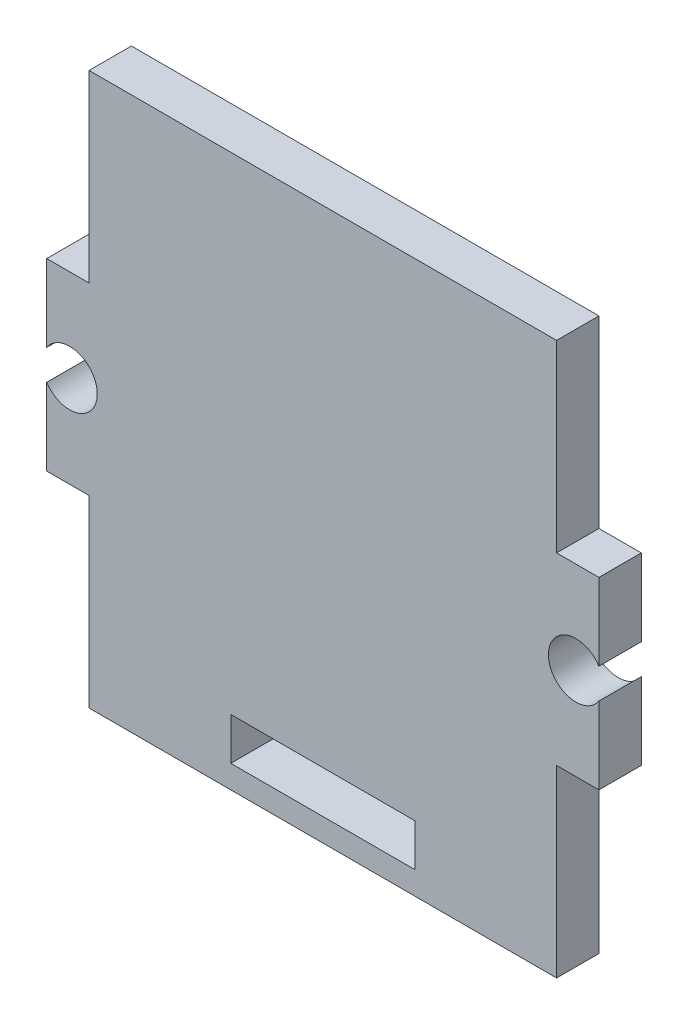
ISO-10303-21;
HEADER;
FILE_DESCRIPTION(('STEP AP214'),'2;1');
FILE_NAME('part.step','',(''),(''),'','','');
FILE_SCHEMA(('AUTOMOTIVE_DESIGN { 1 0 10303 214 1 1 1 1 }'));
ENDSEC;
DATA;
#1=APPLICATION_CONTEXT('core data for automotive mechanical design processes');
#2=APPLICATION_PROTOCOL_DEFINITION('international standard','automotive_design',2000,#1);
#3=PRODUCT_CONTEXT('',#1,'mechanical');
#4=PRODUCT('Part','Part','',(#3));
#5=PRODUCT_RELATED_PRODUCT_CATEGORY('part','',(#4));
#6=PRODUCT_DEFINITION_FORMATION('','',#4);
#7=PRODUCT_DEFINITION_CONTEXT('part definition',#1,'design');
#8=PRODUCT_DEFINITION('design','',#6,#7);
#9=PRODUCT_DEFINITION_SHAPE('','',#8);
#10=(LENGTH_UNIT() NAMED_UNIT(*) SI_UNIT(.MILLI.,.METRE.));
#11=(NAMED_UNIT(*) PLANE_ANGLE_UNIT() SI_UNIT($,.RADIAN.));
#12=(NAMED_UNIT(*) SI_UNIT($,.STERADIAN.) SOLID_ANGLE_UNIT());
#13=UNCERTAINTY_MEASURE_WITH_UNIT(LENGTH_MEASURE(1.E-05),#10,'distance_accuracy_value','');
#14=(GEOMETRIC_REPRESENTATION_CONTEXT(3) GLOBAL_UNCERTAINTY_ASSIGNED_CONTEXT((#13)) GLOBAL_UNIT_ASSIGNED_CONTEXT((#10,
#11,#12)) REPRESENTATION_CONTEXT('',''));
#15=CARTESIAN_POINT('',(0.,0.,0.));
#16=DIRECTION('',(0.,0.,1.));
#17=DIRECTION('',(1.,0.,0.));
#18=AXIS2_PLACEMENT_3D('',#15,#16,#17);
#19=CARTESIAN_POINT('',(0.,-1.5875,-2.921));
#20=DIRECTION('',(1.,0.,0.));
#21=DIRECTION('',(0.,0.,-1.));
#22=AXIS2_PLACEMENT_3D('',#19,#20,#21);
#23=PLANE('',#22);
#24=DIRECTION('',(0.,0.,1.));
#25=VECTOR('',#24,1.);
#26=CARTESIAN_POINT('',(0.,18.5039967942821,0.));
#27=LINE('',#26,#25);
#28=CARTESIAN_POINT('',(0.,18.5039967942821,-2.921));
#29=VERTEX_POINT('',#28);
#30=CARTESIAN_POINT('',(0.,18.5039967942821,0.));
#31=VERTEX_POINT('',#30);
#32=EDGE_CURVE('E13',#29,#31,#27,.T.);
#33=ORIENTED_EDGE('',*,*,#32,.F.);
#34=DIRECTION('',(0.,1.,0.));
#35=VECTOR('',#34,1.);
#36=CARTESIAN_POINT('',(0.,-1.5875,-2.921));
#37=LINE('',#36,#35);
#38=CARTESIAN_POINT('',(0.,23.8125,-2.921));
#39=VERTEX_POINT('',#38);
#40=EDGE_CURVE('E184',#29,#39,#37,.T.);
#41=ORIENTED_EDGE('',*,*,#40,.T.);
#42=DIRECTION('',(0.,0.,1.));
#43=VECTOR('',#42,1.);
#44=CARTESIAN_POINT('',(0.,23.8125,-2.921));
#45=LINE('',#44,#43);
#46=CARTESIAN_POINT('',(0.,23.8125,0.));
#47=VERTEX_POINT('',#46);
#48=EDGE_CURVE('E389',#39,#47,#45,.T.);
#49=ORIENTED_EDGE('',*,*,#48,.T.);
#50=DIRECTION('',(0.,1.,0.));
#51=VECTOR('',#50,1.);
#52=CARTESIAN_POINT('',(0.,-1.5875,0.));
#53=LINE('',#52,#51);
#54=EDGE_CURVE('E186',#31,#47,#53,.T.);
#55=ORIENTED_EDGE('',*,*,#54,.F.);
#56=EDGE_LOOP('',(#33,#41,#49,#55));
#57=FACE_BOUND('',#56,.T.);
#58=ADVANCED_FACE('F39',(#57),#23,.T.);
#59=CARTESIAN_POINT('',(-38.1,-1.5875,-2.921));
#60=DIRECTION('',(1.,0.,0.));
#61=DIRECTION('',(0.,0.,-1.));
#62=AXIS2_PLACEMENT_3D('',#59,#60,#61);
#63=PLANE('',#62);
#64=DIRECTION('',(0.,1.,0.));
#65=VECTOR('',#64,1.);
#66=CARTESIAN_POINT('',(-38.1,-1.5875,-2.921));
#67=LINE('',#66,#65);
#68=CARTESIAN_POINT('',(-38.1,18.5039967942821,-2.921));
#69=VERTEX_POINT('',#68);
#70=CARTESIAN_POINT('',(-38.1,23.8125,-2.921));
#71=VERTEX_POINT('',#70);
#72=EDGE_CURVE('E275',#69,#71,#67,.T.);
#73=ORIENTED_EDGE('',*,*,#72,.F.);
#74=DIRECTION('',(0.,0.,1.));
#75=VECTOR('',#74,1.);
#76=CARTESIAN_POINT('',(-38.1,18.5039967942821,0.));
#77=LINE('',#76,#75);
#78=CARTESIAN_POINT('',(-38.1,18.5039967942821,0.));
#79=VERTEX_POINT('',#78);
#80=EDGE_CURVE('E410',#69,#79,#77,.T.);
#81=ORIENTED_EDGE('',*,*,#80,.T.);
#82=DIRECTION('',(0.,1.,0.));
#83=VECTOR('',#82,1.);
#84=CARTESIAN_POINT('',(-38.1,-1.5875,0.));
#85=LINE('',#84,#83);
#86=CARTESIAN_POINT('',(-38.1,23.8125,0.));
#87=VERTEX_POINT('',#86);
#88=EDGE_CURVE('E207',#79,#87,#85,.T.);
#89=ORIENTED_EDGE('',*,*,#88,.T.);
#90=DIRECTION('',(0.,0.,1.));
#91=VECTOR('',#90,1.);
#92=CARTESIAN_POINT('',(-38.1,23.8125,-2.921));
#93=LINE('',#92,#91);
#94=EDGE_CURVE('E294',#71,#87,#93,.T.);
#95=ORIENTED_EDGE('',*,*,#94,.F.);
#96=EDGE_LOOP('',(#73,#81,#89,#95));
#97=FACE_BOUND('',#96,.T.);
#98=ADVANCED_FACE('F301',(#97),#63,.F.);
#99=CARTESIAN_POINT('',(0.,0.,-2.921));
#100=DIRECTION('',(0.,0.,-1.));
#101=DIRECTION('',(-1.,0.,0.));
#102=AXIS2_PLACEMENT_3D('',#99,#100,#101);
#103=PLANE('',#102);
#104=CARTESIAN_POINT('',(-1.5875,17.4625,-2.921));
#105=DIRECTION('',(0.,0.,1.));
#106=DIRECTION('',(1.,0.,0.));
#107=AXIS2_PLACEMENT_3D('',#104,#105,#106);
#108=CIRCLE('',#107,1.89865);
#109=CARTESIAN_POINT('',(0.,16.4210032057179,-2.921));
#110=VERTEX_POINT('',#109);
#111=EDGE_CURVE('E173',#29,#110,#108,.T.);
#112=ORIENTED_EDGE('',*,*,#111,.T.);
#113=CARTESIAN_POINT('',(0.,11.1125,-2.921));
#114=VERTEX_POINT('',#113);
#115=EDGE_CURVE('E193',#114,#110,#37,.T.);
#116=ORIENTED_EDGE('',*,*,#115,.F.);
#117=DIRECTION('',(-1.,0.,0.));
#118=VECTOR('',#117,1.);
#119=CARTESIAN_POINT('',(0.,11.1125,-2.921));
#120=LINE('',#119,#118);
#121=CARTESIAN_POINT('',(-2.921,11.1125,-2.921));
#122=VERTEX_POINT('',#121);
#123=EDGE_CURVE('E221',#114,#122,#120,.T.);
#124=ORIENTED_EDGE('',*,*,#123,.T.);
#125=DIRECTION('',(0.,-1.,0.));
#126=VECTOR('',#125,1.);
#127=CARTESIAN_POINT('',(-2.921,11.1125,-2.921));
#128=LINE('',#127,#126);
#129=CARTESIAN_POINT('',(-2.921,-1.5875,-2.921));
#130=VERTEX_POINT('',#129);
#131=EDGE_CURVE('E233',#122,#130,#128,.T.);
#132=ORIENTED_EDGE('',*,*,#131,.T.);
#133=DIRECTION('',(-1.,0.,0.));
#134=VECTOR('',#133,1.);
#135=CARTESIAN_POINT('',(0.,-1.5875,-2.921));
#136=LINE('',#135,#134);
#137=CARTESIAN_POINT('',(-35.179,-1.5875,-2.921));
#138=VERTEX_POINT('',#137);
#139=EDGE_CURVE('E273',#130,#138,#136,.T.);
#140=ORIENTED_EDGE('',*,*,#139,.T.);
#141=DIRECTION('',(0.,1.,0.));
#142=VECTOR('',#141,1.);
#143=CARTESIAN_POINT('',(-35.179,11.1125,-2.921));
#144=LINE('',#143,#142);
#145=CARTESIAN_POINT('',(-35.179,11.1125,-2.921));
#146=VERTEX_POINT('',#145);
#147=EDGE_CURVE('E353',#138,#146,#144,.T.);
#148=ORIENTED_EDGE('',*,*,#147,.T.);
#149=DIRECTION('',(-1.,0.,0.));
#150=VECTOR('',#149,1.);
#151=CARTESIAN_POINT('',(-38.1,11.1125,-2.921));
#152=LINE('',#151,#150);
#153=CARTESIAN_POINT('',(-38.1,11.1125,-2.921));
#154=VERTEX_POINT('',#153);
#155=EDGE_CURVE('E364',#146,#154,#152,.T.);
#156=ORIENTED_EDGE('',*,*,#155,.T.);
#157=CARTESIAN_POINT('',(-38.1,16.4210032057179,-2.921));
#158=VERTEX_POINT('',#157);
#159=EDGE_CURVE('E198',#154,#158,#67,.T.);
#160=ORIENTED_EDGE('',*,*,#159,.T.);
#161=CARTESIAN_POINT('',(-36.5125,17.4625,-2.921));
#162=DIRECTION('',(0.,0.,1.));
#163=DIRECTION('',(1.,0.,0.));
#164=AXIS2_PLACEMENT_3D('',#161,#162,#163);
#165=CIRCLE('',#164,1.89865);
#166=EDGE_CURVE('E286',#158,#69,#165,.T.);
#167=ORIENTED_EDGE('',*,*,#166,.T.);
#168=ORIENTED_EDGE('',*,*,#72,.T.);
#169=DIRECTION('',(1.,0.,0.));
#170=VECTOR('',#169,1.);
#171=CARTESIAN_POINT('',(-35.179,23.8125,-2.921));
#172=LINE('',#171,#170);
#173=CARTESIAN_POINT('',(-35.179,23.8125,-2.921));
#174=VERTEX_POINT('',#173);
#175=EDGE_CURVE('E285',#71,#174,#172,.T.);
#176=ORIENTED_EDGE('',*,*,#175,.T.);
#177=DIRECTION('',(0.,1.,0.));
#178=VECTOR('',#177,1.);
#179=CARTESIAN_POINT('',(-35.179,36.5125,-2.921));
#180=LINE('',#179,#178);
#181=CARTESIAN_POINT('',(-35.179,36.5125,-2.921));
#182=VERTEX_POINT('',#181);
#183=EDGE_CURVE('E298',#174,#182,#180,.T.);
#184=ORIENTED_EDGE('',*,*,#183,.T.);
#185=DIRECTION('',(-1.,0.,0.));
#186=VECTOR('',#185,1.);
#187=CARTESIAN_POINT('',(0.,36.5125,-2.921));
#188=LINE('',#187,#186);
#189=CARTESIAN_POINT('',(-2.921,36.5125,-2.921));
#190=VERTEX_POINT('',#189);
#191=EDGE_CURVE('E194',#190,#182,#188,.T.);
#192=ORIENTED_EDGE('',*,*,#191,.F.);
#193=DIRECTION('',(0.,-1.,0.));
#194=VECTOR('',#193,1.);
#195=CARTESIAN_POINT('',(-2.921,36.5125,-2.921));
#196=LINE('',#195,#194);
#197=CARTESIAN_POINT('',(-2.921,23.8125,-2.921));
#198=VERTEX_POINT('',#197);
#199=EDGE_CURVE('E309',#190,#198,#196,.T.);
#200=ORIENTED_EDGE('',*,*,#199,.T.);
#201=DIRECTION('',(1.,0.,0.));
#202=VECTOR('',#201,1.);
#203=CARTESIAN_POINT('',(-2.921,23.8125,-2.921));
#204=LINE('',#203,#202);
#205=EDGE_CURVE('E192',#198,#39,#204,.T.);
#206=ORIENTED_EDGE('',*,*,#205,.T.);
#207=ORIENTED_EDGE('',*,*,#40,.F.);
#208=EDGE_LOOP('',(#112,#116,#124,#132,#140,#148,#156,#160,#167,#168,#176,#184,#192,#200,#206,#207));
#209=FACE_BOUND('',#208,.T.);
#210=DIRECTION('',(-1.,0.,0.));
#211=VECTOR('',#210,1.);
#212=CARTESIAN_POINT('',(-12.7,2.921,-2.921));
#213=LINE('',#212,#211);
#214=CARTESIAN_POINT('',(-12.7,2.921,-2.921));
#215=VERTEX_POINT('',#214);
#216=CARTESIAN_POINT('',(-25.4,2.921,-2.921));
#217=VERTEX_POINT('',#216);
#218=EDGE_CURVE('E234',#215,#217,#213,.T.);
#219=ORIENTED_EDGE('',*,*,#218,.T.);
#220=DIRECTION('',(0.,-1.,0.));
#221=VECTOR('',#220,1.);
#222=CARTESIAN_POINT('',(-25.4,2.921,-2.921));
#223=LINE('',#222,#221);
#224=CARTESIAN_POINT('',(-25.4,0.,-2.921));
#225=VERTEX_POINT('',#224);
#226=EDGE_CURVE('E237',#217,#225,#223,.T.);
#227=ORIENTED_EDGE('',*,*,#226,.T.);
#228=DIRECTION('',(1.,0.,0.));
#229=VECTOR('',#228,1.);
#230=CARTESIAN_POINT('',(-25.4,0.,-2.921));
#231=LINE('',#230,#229);
#232=CARTESIAN_POINT('',(-12.7,0.,-2.921));
#233=VERTEX_POINT('',#232);
#234=EDGE_CURVE('E241',#225,#233,#231,.T.);
#235=ORIENTED_EDGE('',*,*,#234,.T.);
#236=DIRECTION('',(0.,1.,0.));
#237=VECTOR('',#236,1.);
#238=CARTESIAN_POINT('',(-12.7,0.,-2.921));
#239=LINE('',#238,#237);
#240=EDGE_CURVE('E244',#233,#215,#239,.T.);
#241=ORIENTED_EDGE('',*,*,#240,.T.);
#242=EDGE_LOOP('',(#219,#227,#235,#241));
#243=FACE_BOUND('',#242,.T.);
#244=ADVANCED_FACE('F188',(#209,#243),#103,.T.);
#245=CARTESIAN_POINT('',(0.,0.,0.));
#246=DIRECTION('',(0.,0.,-1.));
#247=DIRECTION('',(-1.,0.,0.));
#248=AXIS2_PLACEMENT_3D('',#245,#246,#247);
#249=PLANE('',#248);
#250=DIRECTION('',(0.,-1.,0.));
#251=VECTOR('',#250,1.);
#252=CARTESIAN_POINT('',(-25.4,2.921,0.));
#253=LINE('',#252,#251);
#254=CARTESIAN_POINT('',(-25.4,2.921,0.));
#255=VERTEX_POINT('',#254);
#256=CARTESIAN_POINT('',(-25.4,0.,0.));
#257=VERTEX_POINT('',#256);
#258=EDGE_CURVE('E251',#255,#257,#253,.T.);
#259=ORIENTED_EDGE('',*,*,#258,.F.);
#260=DIRECTION('',(-1.,0.,0.));
#261=VECTOR('',#260,1.);
#262=CARTESIAN_POINT('',(-12.7,2.921,0.));
#263=LINE('',#262,#261);
#264=CARTESIAN_POINT('',(-12.7,2.921,0.));
#265=VERTEX_POINT('',#264);
#266=EDGE_CURVE('E228',#265,#255,#263,.T.);
#267=ORIENTED_EDGE('',*,*,#266,.F.);
#268=DIRECTION('',(0.,1.,0.));
#269=VECTOR('',#268,1.);
#270=CARTESIAN_POINT('',(-12.7,0.,0.));
#271=LINE('',#270,#269);
#272=CARTESIAN_POINT('',(-12.7,0.,0.));
#273=VERTEX_POINT('',#272);
#274=EDGE_CURVE('E238',#273,#265,#271,.T.);
#275=ORIENTED_EDGE('',*,*,#274,.F.);
#276=DIRECTION('',(1.,0.,0.));
#277=VECTOR('',#276,1.);
#278=CARTESIAN_POINT('',(-25.4,0.,0.));
#279=LINE('',#278,#277);
#280=EDGE_CURVE('E264',#257,#273,#279,.T.);
#281=ORIENTED_EDGE('',*,*,#280,.F.);
#282=EDGE_LOOP('',(#259,#267,#275,#281));
#283=FACE_BOUND('',#282,.T.);
#284=CARTESIAN_POINT('',(0.,11.1125,0.));
#285=VERTEX_POINT('',#284);
#286=CARTESIAN_POINT('',(0.,16.4210032057179,0.));
#287=VERTEX_POINT('',#286);
#288=EDGE_CURVE('E276',#285,#287,#53,.T.);
#289=ORIENTED_EDGE('',*,*,#288,.T.);
#290=CARTESIAN_POINT('',(-1.5875,17.4625,0.));
#291=DIRECTION('',(0.,0.,1.));
#292=DIRECTION('',(1.,0.,0.));
#293=AXIS2_PLACEMENT_3D('',#290,#291,#292);
#294=CIRCLE('',#293,1.89864999999999);
#295=EDGE_CURVE('E53',#31,#287,#294,.T.);
#296=ORIENTED_EDGE('',*,*,#295,.F.);
#297=ORIENTED_EDGE('',*,*,#54,.T.);
#298=DIRECTION('',(1.,0.,0.));
#299=VECTOR('',#298,1.);
#300=CARTESIAN_POINT('',(-2.921,23.8125,0.));
#301=LINE('',#300,#299);
#302=CARTESIAN_POINT('',(-2.921,23.8125,0.));
#303=VERTEX_POINT('',#302);
#304=EDGE_CURVE('E311',#303,#47,#301,.T.);
#305=ORIENTED_EDGE('',*,*,#304,.F.);
#306=DIRECTION('',(0.,-1.,0.));
#307=VECTOR('',#306,1.);
#308=CARTESIAN_POINT('',(-2.921,36.5125,0.));
#309=LINE('',#308,#307);
#310=CARTESIAN_POINT('',(-2.921,36.5125,0.));
#311=VERTEX_POINT('',#310);
#312=EDGE_CURVE('E314',#311,#303,#309,.T.);
#313=ORIENTED_EDGE('',*,*,#312,.F.);
#314=DIRECTION('',(-1.,0.,0.));
#315=VECTOR('',#314,1.);
#316=CARTESIAN_POINT('',(0.,36.5125,0.));
#317=LINE('',#316,#315);
#318=CARTESIAN_POINT('',(-35.179,36.5125,0.));
#319=VERTEX_POINT('',#318);
#320=EDGE_CURVE('E327',#311,#319,#317,.T.);
#321=ORIENTED_EDGE('',*,*,#320,.T.);
#322=DIRECTION('',(0.,1.,0.));
#323=VECTOR('',#322,1.);
#324=CARTESIAN_POINT('',(-35.179,36.5125,0.));
#325=LINE('',#324,#323);
#326=CARTESIAN_POINT('',(-35.179,23.8125,0.));
#327=VERTEX_POINT('',#326);
#328=EDGE_CURVE('E299',#327,#319,#325,.T.);
#329=ORIENTED_EDGE('',*,*,#328,.F.);
#330=DIRECTION('',(1.,0.,0.));
#331=VECTOR('',#330,1.);
#332=CARTESIAN_POINT('',(-35.179,23.8125,0.));
#333=LINE('',#332,#331);
#334=EDGE_CURVE('E360',#87,#327,#333,.T.);
#335=ORIENTED_EDGE('',*,*,#334,.F.);
#336=ORIENTED_EDGE('',*,*,#88,.F.);
#337=CARTESIAN_POINT('',(-36.5125,17.4625,0.));
#338=DIRECTION('',(0.,0.,1.));
#339=DIRECTION('',(1.,0.,0.));
#340=AXIS2_PLACEMENT_3D('',#337,#338,#339);
#341=CIRCLE('',#340,1.89864999999999);
#342=CARTESIAN_POINT('',(-38.1,16.4210032057179,0.));
#343=VERTEX_POINT('',#342);
#344=EDGE_CURVE('E196',#343,#79,#341,.T.);
#345=ORIENTED_EDGE('',*,*,#344,.F.);
#346=CARTESIAN_POINT('',(-38.1,11.1125,0.));
#347=VERTEX_POINT('',#346);
#348=EDGE_CURVE('E209',#347,#343,#85,.T.);
#349=ORIENTED_EDGE('',*,*,#348,.F.);
#350=DIRECTION('',(-1.,0.,0.));
#351=VECTOR('',#350,1.);
#352=CARTESIAN_POINT('',(-38.1,11.1125,0.));
#353=LINE('',#352,#351);
#354=CARTESIAN_POINT('',(-35.179,11.1125,0.));
#355=VERTEX_POINT('',#354);
#356=EDGE_CURVE('E349',#355,#347,#353,.T.);
#357=ORIENTED_EDGE('',*,*,#356,.F.);
#358=DIRECTION('',(0.,1.,0.));
#359=VECTOR('',#358,1.);
#360=CARTESIAN_POINT('',(-35.179,11.1125,0.));
#361=LINE('',#360,#359);
#362=CARTESIAN_POINT('',(-35.179,-1.5875,0.));
#363=VERTEX_POINT('',#362);
#364=EDGE_CURVE('E354',#363,#355,#361,.T.);
#365=ORIENTED_EDGE('',*,*,#364,.F.);
#366=DIRECTION('',(-1.,0.,0.));
#367=VECTOR('',#366,1.);
#368=CARTESIAN_POINT('',(0.,-1.5875,0.));
#369=LINE('',#368,#367);
#370=CARTESIAN_POINT('',(-2.921,-1.5875,0.));
#371=VERTEX_POINT('',#370);
#372=EDGE_CURVE('E202',#371,#363,#369,.T.);
#373=ORIENTED_EDGE('',*,*,#372,.F.);
#374=DIRECTION('',(0.,-1.,0.));
#375=VECTOR('',#374,1.);
#376=CARTESIAN_POINT('',(-2.921,11.1125,0.));
#377=LINE('',#376,#375);
#378=CARTESIAN_POINT('',(-2.921,11.1125,0.));
#379=VERTEX_POINT('',#378);
#380=EDGE_CURVE('E217',#379,#371,#377,.T.);
#381=ORIENTED_EDGE('',*,*,#380,.F.);
#382=DIRECTION('',(-1.,0.,0.));
#383=VECTOR('',#382,1.);
#384=CARTESIAN_POINT('',(0.,11.1125,0.));
#385=LINE('',#384,#383);
#386=EDGE_CURVE('E222',#285,#379,#385,.T.);
#387=ORIENTED_EDGE('',*,*,#386,.F.);
#388=EDGE_LOOP('',(#289,#296,#297,#305,#313,#321,#329,#335,#336,#345,#349,#357,#365,#373,#381,#387));
#389=FACE_BOUND('',#388,.T.);
#390=ADVANCED_FACE('F380',(#283,#389),#249,.F.);
#391=CARTESIAN_POINT('',(0.,-1.5875,-2.921));
#392=DIRECTION('',(0.,1.,0.));
#393=DIRECTION('',(-1.,0.,0.));
#394=AXIS2_PLACEMENT_3D('',#391,#392,#393);
#395=PLANE('',#394);
#396=ORIENTED_EDGE('',*,*,#372,.T.);
#397=DIRECTION('',(0.,0.,1.));
#398=VECTOR('',#397,1.);
#399=CARTESIAN_POINT('',(-35.179,-1.5875,-2.921));
#400=LINE('',#399,#398);
#401=EDGE_CURVE('E363',#138,#363,#400,.T.);
#402=ORIENTED_EDGE('',*,*,#401,.F.);
#403=ORIENTED_EDGE('',*,*,#139,.F.);
#404=DIRECTION('',(0.,0.,1.));
#405=VECTOR('',#404,1.);
#406=CARTESIAN_POINT('',(-2.921,-1.5875,-2.921));
#407=LINE('',#406,#405);
#408=EDGE_CURVE('E225',#130,#371,#407,.T.);
#409=ORIENTED_EDGE('',*,*,#408,.T.);
#410=EDGE_LOOP('',(#396,#402,#403,#409));
#411=FACE_BOUND('',#410,.T.);
#412=ADVANCED_FACE('F41',(#411),#395,.F.);
#413=ORIENTED_EDGE('',*,*,#348,.T.);
#414=DIRECTION('',(0.,0.,1.));
#415=VECTOR('',#414,1.);
#416=CARTESIAN_POINT('',(-38.1,16.4210032057179,0.));
#417=LINE('',#416,#415);
#418=EDGE_CURVE('E61',#343,#158,#417,.F.);
#419=ORIENTED_EDGE('',*,*,#418,.T.);
#420=ORIENTED_EDGE('',*,*,#159,.F.);
#421=DIRECTION('',(0.,0.,1.));
#422=VECTOR('',#421,1.);
#423=CARTESIAN_POINT('',(-38.1,11.1125,-2.921));
#424=LINE('',#423,#422);
#425=EDGE_CURVE('E357',#154,#347,#424,.T.);
#426=ORIENTED_EDGE('',*,*,#425,.T.);
#427=EDGE_LOOP('',(#413,#419,#420,#426));
#428=FACE_BOUND('',#427,.T.);
#429=ADVANCED_FACE('F417',(#428),#63,.F.);
#430=CARTESIAN_POINT('',(0.,36.5125,-2.921));
#431=DIRECTION('',(0.,1.,0.));
#432=DIRECTION('',(-1.,0.,0.));
#433=AXIS2_PLACEMENT_3D('',#430,#431,#432);
#434=PLANE('',#433);
#435=DIRECTION('',(0.,0.,1.));
#436=VECTOR('',#435,1.);
#437=CARTESIAN_POINT('',(-35.179,36.5125,-2.921));
#438=LINE('',#437,#436);
#439=EDGE_CURVE('E304',#182,#319,#438,.T.);
#440=ORIENTED_EDGE('',*,*,#439,.T.);
#441=ORIENTED_EDGE('',*,*,#320,.F.);
#442=DIRECTION('',(0.,0.,1.));
#443=VECTOR('',#442,1.);
#444=CARTESIAN_POINT('',(-2.921,36.5125,-2.921));
#445=LINE('',#444,#443);
#446=EDGE_CURVE('E386',#190,#311,#445,.T.);
#447=ORIENTED_EDGE('',*,*,#446,.F.);
#448=ORIENTED_EDGE('',*,*,#191,.T.);
#449=EDGE_LOOP('',(#440,#441,#447,#448));
#450=FACE_BOUND('',#449,.T.);
#451=ADVANCED_FACE('F373',(#450),#434,.T.);
#452=DIRECTION('',(0.,0.,1.));
#453=VECTOR('',#452,1.);
#454=CARTESIAN_POINT('',(0.,16.4210032057179,0.));
#455=LINE('',#454,#453);
#456=EDGE_CURVE('E47',#287,#110,#455,.F.);
#457=ORIENTED_EDGE('',*,*,#456,.F.);
#458=ORIENTED_EDGE('',*,*,#288,.F.);
#459=DIRECTION('',(0.,0.,1.));
#460=VECTOR('',#459,1.);
#461=CARTESIAN_POINT('',(0.,11.1125,-2.921));
#462=LINE('',#461,#460);
#463=EDGE_CURVE('E231',#114,#285,#462,.T.);
#464=ORIENTED_EDGE('',*,*,#463,.F.);
#465=ORIENTED_EDGE('',*,*,#115,.T.);
#466=EDGE_LOOP('',(#457,#458,#464,#465));
#467=FACE_BOUND('',#466,.T.);
#468=ADVANCED_FACE('F450',(#467),#23,.T.);
#469=CARTESIAN_POINT('',(-12.7,2.921,-2.921));
#470=DIRECTION('',(0.,1.,0.));
#471=DIRECTION('',(0.,0.,1.));
#472=AXIS2_PLACEMENT_3D('',#469,#470,#471);
#473=PLANE('',#472);
#474=ORIENTED_EDGE('',*,*,#266,.T.);
#475=DIRECTION('',(0.,0.,1.));
#476=VECTOR('',#475,1.);
#477=CARTESIAN_POINT('',(-25.4,2.921,-2.921));
#478=LINE('',#477,#476);
#479=EDGE_CURVE('E247',#217,#255,#478,.T.);
#480=ORIENTED_EDGE('',*,*,#479,.F.);
#481=ORIENTED_EDGE('',*,*,#218,.F.);
#482=DIRECTION('',(0.,0.,1.));
#483=VECTOR('',#482,1.);
#484=CARTESIAN_POINT('',(-12.7,2.921,-2.921));
#485=LINE('',#484,#483);
#486=EDGE_CURVE('E208',#215,#265,#485,.T.);
#487=ORIENTED_EDGE('',*,*,#486,.T.);
#488=EDGE_LOOP('',(#474,#480,#481,#487));
#489=FACE_BOUND('',#488,.T.);
#490=ADVANCED_FACE('F440',(#489),#473,.F.);
#491=CARTESIAN_POINT('',(-12.7,0.,-2.921));
#492=DIRECTION('',(1.,0.,0.));
#493=DIRECTION('',(0.,0.,-1.));
#494=AXIS2_PLACEMENT_3D('',#491,#492,#493);
#495=PLANE('',#494);
#496=ORIENTED_EDGE('',*,*,#274,.T.);
#497=ORIENTED_EDGE('',*,*,#486,.F.);
#498=ORIENTED_EDGE('',*,*,#240,.F.);
#499=DIRECTION('',(0.,0.,1.));
#500=VECTOR('',#499,1.);
#501=CARTESIAN_POINT('',(-12.7,0.,-2.921));
#502=LINE('',#501,#500);
#503=EDGE_CURVE('E267',#233,#273,#502,.T.);
#504=ORIENTED_EDGE('',*,*,#503,.T.);
#505=EDGE_LOOP('',(#496,#497,#498,#504));
#506=FACE_BOUND('',#505,.T.);
#507=ADVANCED_FACE('F442',(#506),#495,.F.);
#508=CARTESIAN_POINT('',(-25.4,0.,-2.921));
#509=DIRECTION('',(0.,-1.,0.));
#510=DIRECTION('',(0.,0.,-1.));
#511=AXIS2_PLACEMENT_3D('',#508,#509,#510);
#512=PLANE('',#511);
#513=ORIENTED_EDGE('',*,*,#280,.T.);
#514=ORIENTED_EDGE('',*,*,#503,.F.);
#515=ORIENTED_EDGE('',*,*,#234,.F.);
#516=DIRECTION('',(0.,0.,1.));
#517=VECTOR('',#516,1.);
#518=CARTESIAN_POINT('',(-25.4,0.,-2.921));
#519=LINE('',#518,#517);
#520=EDGE_CURVE('E269',#225,#257,#519,.T.);
#521=ORIENTED_EDGE('',*,*,#520,.T.);
#522=EDGE_LOOP('',(#513,#514,#515,#521));
#523=FACE_BOUND('',#522,.T.);
#524=ADVANCED_FACE('F436',(#523),#512,.F.);
#525=CARTESIAN_POINT('',(-25.4,2.921,-2.921));
#526=DIRECTION('',(-1.,0.,0.));
#527=DIRECTION('',(0.,-1.,0.));
#528=AXIS2_PLACEMENT_3D('',#525,#526,#527);
#529=PLANE('',#528);
#530=ORIENTED_EDGE('',*,*,#258,.T.);
#531=ORIENTED_EDGE('',*,*,#520,.F.);
#532=ORIENTED_EDGE('',*,*,#226,.F.);
#533=ORIENTED_EDGE('',*,*,#479,.T.);
#534=EDGE_LOOP('',(#530,#531,#532,#533));
#535=FACE_BOUND('',#534,.T.);
#536=ADVANCED_FACE('F430',(#535),#529,.F.);
#537=CARTESIAN_POINT('',(-2.921,11.1125,-2.921));
#538=DIRECTION('',(-1.,0.,0.));
#539=DIRECTION('',(0.,0.,1.));
#540=AXIS2_PLACEMENT_3D('',#537,#538,#539);
#541=PLANE('',#540);
#542=ORIENTED_EDGE('',*,*,#380,.T.);
#543=ORIENTED_EDGE('',*,*,#408,.F.);
#544=ORIENTED_EDGE('',*,*,#131,.F.);
#545=DIRECTION('',(0.,0.,1.));
#546=VECTOR('',#545,1.);
#547=CARTESIAN_POINT('',(-2.921,11.1125,-2.921));
#548=LINE('',#547,#546);
#549=EDGE_CURVE('E229',#122,#379,#548,.T.);
#550=ORIENTED_EDGE('',*,*,#549,.T.);
#551=EDGE_LOOP('',(#542,#543,#544,#550));
#552=FACE_BOUND('',#551,.T.);
#553=ADVANCED_FACE('F472',(#552),#541,.F.);
#554=CARTESIAN_POINT('',(0.,11.1125,-2.921));
#555=DIRECTION('',(0.,1.,0.));
#556=DIRECTION('',(-1.,0.,0.));
#557=AXIS2_PLACEMENT_3D('',#554,#555,#556);
#558=PLANE('',#557);
#559=ORIENTED_EDGE('',*,*,#386,.T.);
#560=ORIENTED_EDGE('',*,*,#549,.F.);
#561=ORIENTED_EDGE('',*,*,#123,.F.);
#562=ORIENTED_EDGE('',*,*,#463,.T.);
#563=EDGE_LOOP('',(#559,#560,#561,#562));
#564=FACE_BOUND('',#563,.T.);
#565=ADVANCED_FACE('F471',(#564),#558,.F.);
#566=CARTESIAN_POINT('',(-2.921,36.5125,-2.921));
#567=DIRECTION('',(-1.,0.,0.));
#568=DIRECTION('',(0.,0.,1.));
#569=AXIS2_PLACEMENT_3D('',#566,#567,#568);
#570=PLANE('',#569);
#571=ORIENTED_EDGE('',*,*,#312,.T.);
#572=DIRECTION('',(0.,0.,1.));
#573=VECTOR('',#572,1.);
#574=CARTESIAN_POINT('',(-2.921,23.8125,-2.921));
#575=LINE('',#574,#573);
#576=EDGE_CURVE('E313',#198,#303,#575,.T.);
#577=ORIENTED_EDGE('',*,*,#576,.F.);
#578=ORIENTED_EDGE('',*,*,#199,.F.);
#579=ORIENTED_EDGE('',*,*,#446,.T.);
#580=EDGE_LOOP('',(#571,#577,#578,#579));
#581=FACE_BOUND('',#580,.T.);
#582=ADVANCED_FACE('F385',(#581),#570,.F.);
#583=CARTESIAN_POINT('',(-2.921,23.8125,-2.921));
#584=DIRECTION('',(0.,-1.,0.));
#585=DIRECTION('',(0.,0.,-1.));
#586=AXIS2_PLACEMENT_3D('',#583,#584,#585);
#587=PLANE('',#586);
#588=ORIENTED_EDGE('',*,*,#304,.T.);
#589=ORIENTED_EDGE('',*,*,#48,.F.);
#590=ORIENTED_EDGE('',*,*,#205,.F.);
#591=ORIENTED_EDGE('',*,*,#576,.T.);
#592=EDGE_LOOP('',(#588,#589,#590,#591));
#593=FACE_BOUND('',#592,.T.);
#594=ADVANCED_FACE('F388',(#593),#587,.F.);
#595=CARTESIAN_POINT('',(-35.179,36.5125,-2.921));
#596=DIRECTION('',(1.,0.,0.));
#597=DIRECTION('',(0.,0.,-1.));
#598=AXIS2_PLACEMENT_3D('',#595,#596,#597);
#599=PLANE('',#598);
#600=ORIENTED_EDGE('',*,*,#328,.T.);
#601=ORIENTED_EDGE('',*,*,#439,.F.);
#602=ORIENTED_EDGE('',*,*,#183,.F.);
#603=DIRECTION('',(0.,0.,1.));
#604=VECTOR('',#603,1.);
#605=CARTESIAN_POINT('',(-35.179,23.8125,-2.921));
#606=LINE('',#605,#604);
#607=EDGE_CURVE('E296',#174,#327,#606,.T.);
#608=ORIENTED_EDGE('',*,*,#607,.T.);
#609=EDGE_LOOP('',(#600,#601,#602,#608));
#610=FACE_BOUND('',#609,.T.);
#611=ADVANCED_FACE('F485',(#610),#599,.F.);
#612=CARTESIAN_POINT('',(-35.179,23.8125,-2.921));
#613=DIRECTION('',(0.,-1.,0.));
#614=DIRECTION('',(1.,0.,0.));
#615=AXIS2_PLACEMENT_3D('',#612,#613,#614);
#616=PLANE('',#615);
#617=ORIENTED_EDGE('',*,*,#334,.T.);
#618=ORIENTED_EDGE('',*,*,#607,.F.);
#619=ORIENTED_EDGE('',*,*,#175,.F.);
#620=ORIENTED_EDGE('',*,*,#94,.T.);
#621=EDGE_LOOP('',(#617,#618,#619,#620));
#622=FACE_BOUND('',#621,.T.);
#623=ADVANCED_FACE('F293',(#622),#616,.F.);
#624=CARTESIAN_POINT('',(-38.1,11.1125,-2.921));
#625=DIRECTION('',(0.,1.,0.));
#626=DIRECTION('',(-1.,0.,0.));
#627=AXIS2_PLACEMENT_3D('',#624,#625,#626);
#628=PLANE('',#627);
#629=ORIENTED_EDGE('',*,*,#356,.T.);
#630=ORIENTED_EDGE('',*,*,#425,.F.);
#631=ORIENTED_EDGE('',*,*,#155,.F.);
#632=DIRECTION('',(0.,0.,1.));
#633=VECTOR('',#632,1.);
#634=CARTESIAN_POINT('',(-35.179,11.1125,-2.921));
#635=LINE('',#634,#633);
#636=EDGE_CURVE('E361',#146,#355,#635,.T.);
#637=ORIENTED_EDGE('',*,*,#636,.T.);
#638=EDGE_LOOP('',(#629,#630,#631,#637));
#639=FACE_BOUND('',#638,.T.);
#640=ADVANCED_FACE('F488',(#639),#628,.F.);
#641=CARTESIAN_POINT('',(-35.179,11.1125,-2.921));
#642=DIRECTION('',(1.,0.,0.));
#643=DIRECTION('',(0.,0.,-1.));
#644=AXIS2_PLACEMENT_3D('',#641,#642,#643);
#645=PLANE('',#644);
#646=ORIENTED_EDGE('',*,*,#364,.T.);
#647=ORIENTED_EDGE('',*,*,#636,.F.);
#648=ORIENTED_EDGE('',*,*,#147,.F.);
#649=ORIENTED_EDGE('',*,*,#401,.T.);
#650=EDGE_LOOP('',(#646,#647,#648,#649));
#651=FACE_BOUND('',#650,.T.);
#652=ADVANCED_FACE('F405',(#651),#645,.F.);
#653=CARTESIAN_POINT('',(-36.5125,17.4625,0.));
#654=DIRECTION('',(0.,0.,1.));
#655=DIRECTION('',(1.,0.,0.));
#656=AXIS2_PLACEMENT_3D('',#653,#654,#655);
#657=CYLINDRICAL_SURFACE('',#656,1.89864999999999);
#658=ORIENTED_EDGE('',*,*,#166,.F.);
#659=ORIENTED_EDGE('',*,*,#418,.F.);
#660=ORIENTED_EDGE('',*,*,#344,.T.);
#661=ORIENTED_EDGE('',*,*,#80,.F.);
#662=EDGE_LOOP('',(#658,#659,#660,#661));
#663=FACE_BOUND('',#662,.T.);
#664=ADVANCED_FACE('F493',(#663),#657,.F.);
#665=CARTESIAN_POINT('',(-1.5875,17.4625,0.));
#666=DIRECTION('',(0.,0.,1.));
#667=DIRECTION('',(1.,0.,0.));
#668=AXIS2_PLACEMENT_3D('',#665,#666,#667);
#669=CYLINDRICAL_SURFACE('',#668,1.89864999999999);
#670=ORIENTED_EDGE('',*,*,#32,.T.);
#671=ORIENTED_EDGE('',*,*,#295,.T.);
#672=ORIENTED_EDGE('',*,*,#456,.T.);
#673=ORIENTED_EDGE('',*,*,#111,.F.);
#674=EDGE_LOOP('',(#670,#671,#672,#673));
#675=FACE_BOUND('',#674,.T.);
#676=ADVANCED_FACE('F175',(#675),#669,.F.);
#677=CLOSED_SHELL('',(#58,#98,#244,#390,#412,#429,#451,#468,#490,#507,#524,#536,#553,#565,#582,
#594,#611,#623,#640,#652,#664,#676));
#678=MANIFOLD_SOLID_BREP('B2',#677);
#679=ADVANCED_BREP_SHAPE_REPRESENTATION('',(#18,#678),#14);
#680=SHAPE_DEFINITION_REPRESENTATION(#9,#679);
ENDSEC;
END-ISO-10303-21;
